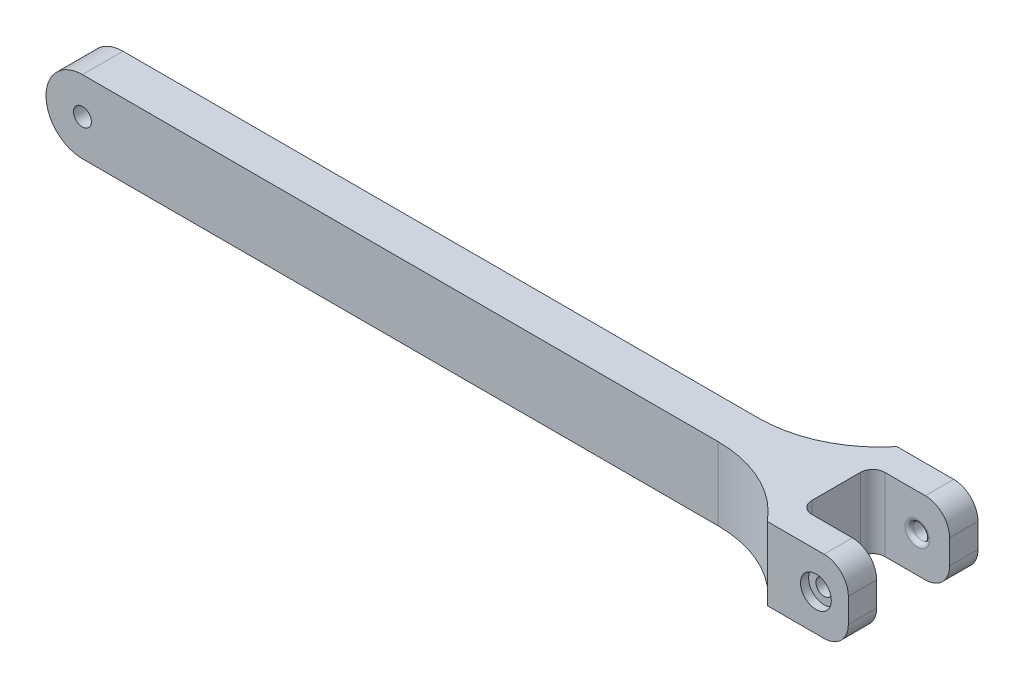
ISO-10303-21;
HEADER;
FILE_DESCRIPTION(('STEP AP214'),'2;1');
FILE_NAME('part.step','',(''),(''),'','','');
FILE_SCHEMA(('AUTOMOTIVE_DESIGN { 1 0 10303 214 1 1 1 1 }'));
ENDSEC;
DATA;
#1=APPLICATION_CONTEXT('core data for automotive mechanical design processes');
#2=APPLICATION_PROTOCOL_DEFINITION('international standard','automotive_design',2000,#1);
#3=PRODUCT_CONTEXT('',#1,'mechanical');
#4=PRODUCT('Part','Part','',(#3));
#5=PRODUCT_RELATED_PRODUCT_CATEGORY('part','',(#4));
#6=PRODUCT_DEFINITION_FORMATION('','',#4);
#7=PRODUCT_DEFINITION_CONTEXT('part definition',#1,'design');
#8=PRODUCT_DEFINITION('design','',#6,#7);
#9=PRODUCT_DEFINITION_SHAPE('','',#8);
#10=(LENGTH_UNIT() NAMED_UNIT(*) SI_UNIT(.MILLI.,.METRE.));
#11=(NAMED_UNIT(*) PLANE_ANGLE_UNIT() SI_UNIT($,.RADIAN.));
#12=(NAMED_UNIT(*) SI_UNIT($,.STERADIAN.) SOLID_ANGLE_UNIT());
#13=UNCERTAINTY_MEASURE_WITH_UNIT(LENGTH_MEASURE(1.E-05),#10,'distance_accuracy_value','');
#14=(GEOMETRIC_REPRESENTATION_CONTEXT(3) GLOBAL_UNCERTAINTY_ASSIGNED_CONTEXT((#13)) GLOBAL_UNIT_ASSIGNED_CONTEXT((#10,
#11,#12)) REPRESENTATION_CONTEXT('',''));
#15=CARTESIAN_POINT('',(0.,0.,0.));
#16=DIRECTION('',(0.,0.,1.));
#17=DIRECTION('',(1.,0.,0.));
#18=AXIS2_PLACEMENT_3D('',#15,#16,#17);
#19=CARTESIAN_POINT('',(96.,0.,-5.5));
#20=DIRECTION('',(0.,0.,1.));
#21=DIRECTION('',(1.,0.,0.));
#22=AXIS2_PLACEMENT_3D('',#19,#20,#21);
#23=CYLINDRICAL_SURFACE('',#22,0.999999999999998);
#24=CARTESIAN_POINT('',(96.,0.,7.));
#25=DIRECTION('',(0.,0.,1.));
#26=DIRECTION('',(1.,0.,0.));
#27=AXIS2_PLACEMENT_3D('',#24,#25,#26);
#28=CIRCLE('',#27,0.999999999999998);
#29=CARTESIAN_POINT('',(97.,0.,7.));
#30=VERTEX_POINT('',#29);
#31=EDGE_CURVE('E344',#30,#30,#28,.T.);
#32=ORIENTED_EDGE('',*,*,#31,.F.);
#33=EDGE_LOOP('',(#32));
#34=FACE_BOUND('',#33,.T.);
#35=CARTESIAN_POINT('',(96.,0.,9.5));
#36=DIRECTION('',(0.,0.,1.));
#37=DIRECTION('',(1.,0.,0.));
#38=AXIS2_PLACEMENT_3D('',#35,#36,#37);
#39=CIRCLE('',#38,0.999999999999998);
#40=CARTESIAN_POINT('',(97.,0.,9.5));
#41=VERTEX_POINT('',#40);
#42=EDGE_CURVE('E282',#41,#41,#39,.F.);
#43=ORIENTED_EDGE('',*,*,#42,.F.);
#44=EDGE_LOOP('',(#43));
#45=FACE_BOUND('',#44,.T.);
#46=ADVANCED_FACE('F36',(#34,#45),#23,.F.);
#47=CARTESIAN_POINT('',(0.,-4.5,5.));
#48=DIRECTION('',(0.,1.,0.));
#49=DIRECTION('',(0.,0.,1.));
#50=AXIS2_PLACEMENT_3D('',#47,#48,#49);
#51=PLANE('',#50);
#52=DIRECTION('',(0.,0.,1.));
#53=VECTOR('',#52,1.);
#54=CARTESIAN_POINT('',(90.5,-4.5,0.));
#55=LINE('',#54,#53);
#56=CARTESIAN_POINT('',(90.5,-4.5,-0.499999999999999));
#57=VERTEX_POINT('',#56);
#58=CARTESIAN_POINT('',(90.5,-4.5,5.5));
#59=VERTEX_POINT('',#58);
#60=EDGE_CURVE('E355',#57,#59,#55,.T.);
#61=ORIENTED_EDGE('',*,*,#60,.T.);
#62=CARTESIAN_POINT('',(92.,-4.5,5.5));
#63=DIRECTION('',(0.,1.,0.));
#64=DIRECTION('',(0.,0.,1.));
#65=AXIS2_PLACEMENT_3D('',#62,#63,#64);
#66=CIRCLE('',#65,1.5);
#67=CARTESIAN_POINT('',(92.,-4.5,7.));
#68=VERTEX_POINT('',#67);
#69=EDGE_CURVE('E51',#59,#68,#66,.T.);
#70=ORIENTED_EDGE('',*,*,#69,.T.);
#71=DIRECTION('',(1.,0.,0.));
#72=VECTOR('',#71,1.);
#73=CARTESIAN_POINT('',(0.,-4.5,7.));
#74=LINE('',#73,#72);
#75=CARTESIAN_POINT('',(97.,-4.5,7.));
#76=VERTEX_POINT('',#75);
#77=EDGE_CURVE('E353',#68,#76,#74,.T.);
#78=ORIENTED_EDGE('',*,*,#77,.T.);
#79=DIRECTION('',(0.,0.,1.));
#80=VECTOR('',#79,1.);
#81=CARTESIAN_POINT('',(97.,-4.5,5.));
#82=LINE('',#81,#80);
#83=CARTESIAN_POINT('',(97.,-4.5,10.5));
#84=VERTEX_POINT('',#83);
#85=EDGE_CURVE('E266',#76,#84,#82,.T.);
#86=ORIENTED_EDGE('',*,*,#85,.T.);
#87=DIRECTION('',(1.,0.,0.));
#88=VECTOR('',#87,1.);
#89=CARTESIAN_POINT('',(0.,-4.5,10.5));
#90=LINE('',#89,#88);
#91=CARTESIAN_POINT('',(90.,-4.5,10.5));
#92=VERTEX_POINT('',#91);
#93=EDGE_CURVE('E186',#92,#84,#90,.T.);
#94=ORIENTED_EDGE('',*,*,#93,.F.);
#95=CARTESIAN_POINT('',(78.3918132337561,-4.5,20.));
#96=DIRECTION('',(0.,1.,0.));
#97=DIRECTION('',(0.,0.,1.));
#98=AXIS2_PLACEMENT_3D('',#95,#96,#97);
#99=CIRCLE('',#98,15.);
#100=CARTESIAN_POINT('',(78.3918132337561,-4.5,5.));
#101=VERTEX_POINT('',#100);
#102=EDGE_CURVE('E241',#92,#101,#99,.T.);
#103=ORIENTED_EDGE('',*,*,#102,.T.);
#104=DIRECTION('',(1.,0.,0.));
#105=VECTOR('',#104,1.);
#106=CARTESIAN_POINT('',(0.,-4.5,5.));
#107=LINE('',#106,#105);
#108=CARTESIAN_POINT('',(0.,-4.5,5.));
#109=VERTEX_POINT('',#108);
#110=EDGE_CURVE('E217',#109,#101,#107,.T.);
#111=ORIENTED_EDGE('',*,*,#110,.F.);
#112=DIRECTION('',(0.,0.,-1.));
#113=VECTOR('',#112,1.);
#114=CARTESIAN_POINT('',(0.,-4.5,5.));
#115=LINE('',#114,#113);
#116=CARTESIAN_POINT('',(0.,-4.5,0.));
#117=VERTEX_POINT('',#116);
#118=EDGE_CURVE('E210',#109,#117,#115,.T.);
#119=ORIENTED_EDGE('',*,*,#118,.T.);
#120=DIRECTION('',(1.,0.,0.));
#121=VECTOR('',#120,1.);
#122=CARTESIAN_POINT('',(0.,-4.5,0.));
#123=LINE('',#122,#121);
#124=CARTESIAN_POINT('',(78.3918132337561,-4.5,0.));
#125=VERTEX_POINT('',#124);
#126=EDGE_CURVE('E170',#117,#125,#123,.T.);
#127=ORIENTED_EDGE('',*,*,#126,.T.);
#128=CARTESIAN_POINT('',(78.3918132337561,-4.5,-15.));
#129=DIRECTION('',(0.,1.,0.));
#130=DIRECTION('',(0.,0.,1.));
#131=AXIS2_PLACEMENT_3D('',#128,#129,#130);
#132=CIRCLE('',#131,15.);
#133=CARTESIAN_POINT('',(90.,-4.5,-5.5));
#134=VERTEX_POINT('',#133);
#135=EDGE_CURVE('E162',#125,#134,#132,.T.);
#136=ORIENTED_EDGE('',*,*,#135,.T.);
#137=DIRECTION('',(1.,0.,0.));
#138=VECTOR('',#137,1.);
#139=CARTESIAN_POINT('',(0.,-4.5,-5.5));
#140=LINE('',#139,#138);
#141=CARTESIAN_POINT('',(97.,-4.5,-5.5));
#142=VERTEX_POINT('',#141);
#143=EDGE_CURVE('E166',#134,#142,#140,.T.);
#144=ORIENTED_EDGE('',*,*,#143,.T.);
#145=DIRECTION('',(0.,0.,1.));
#146=VECTOR('',#145,1.);
#147=CARTESIAN_POINT('',(97.,-4.5,5.));
#148=LINE('',#147,#146);
#149=CARTESIAN_POINT('',(97.,-4.5,-2.));
#150=VERTEX_POINT('',#149);
#151=EDGE_CURVE('E264',#142,#150,#148,.T.);
#152=ORIENTED_EDGE('',*,*,#151,.T.);
#153=DIRECTION('',(-1.,0.,0.));
#154=VECTOR('',#153,1.);
#155=CARTESIAN_POINT('',(0.,-4.5,-1.99999999999999));
#156=LINE('',#155,#154);
#157=CARTESIAN_POINT('',(92.,-4.5,-2.));
#158=VERTEX_POINT('',#157);
#159=EDGE_CURVE('E187',#150,#158,#156,.T.);
#160=ORIENTED_EDGE('',*,*,#159,.T.);
#161=CARTESIAN_POINT('',(92.,-4.5,-0.499999999999999));
#162=DIRECTION('',(0.,1.,0.));
#163=DIRECTION('',(0.,0.,1.));
#164=AXIS2_PLACEMENT_3D('',#161,#162,#163);
#165=CIRCLE('',#164,1.5);
#166=EDGE_CURVE('E297',#158,#57,#165,.T.);
#167=ORIENTED_EDGE('',*,*,#166,.T.);
#168=EDGE_LOOP('',(#61,#70,#78,#86,#94,#103,#111,#119,#127,#136,#144,#152,#160,#167));
#169=FACE_BOUND('',#168,.T.);
#170=ADVANCED_FACE('F164',(#169),#51,.F.);
#171=CARTESIAN_POINT('',(0.,4.5,5.));
#172=DIRECTION('',(0.,1.,0.));
#173=DIRECTION('',(0.,0.,1.));
#174=AXIS2_PLACEMENT_3D('',#171,#172,#173);
#175=PLANE('',#174);
#176=DIRECTION('',(1.,0.,0.));
#177=VECTOR('',#176,1.);
#178=CARTESIAN_POINT('',(0.,4.5,10.5));
#179=LINE('',#178,#177);
#180=CARTESIAN_POINT('',(90.,4.5,10.5));
#181=VERTEX_POINT('',#180);
#182=CARTESIAN_POINT('',(97.,4.5,10.5));
#183=VERTEX_POINT('',#182);
#184=EDGE_CURVE('E356',#181,#183,#179,.T.);
#185=ORIENTED_EDGE('',*,*,#184,.T.);
#186=DIRECTION('',(0.,0.,1.));
#187=VECTOR('',#186,1.);
#188=CARTESIAN_POINT('',(97.,4.5,7.));
#189=LINE('',#188,#187);
#190=CARTESIAN_POINT('',(97.,4.5,7.));
#191=VERTEX_POINT('',#190);
#192=EDGE_CURVE('E256',#183,#191,#189,.F.);
#193=ORIENTED_EDGE('',*,*,#192,.T.);
#194=DIRECTION('',(1.,0.,0.));
#195=VECTOR('',#194,1.);
#196=CARTESIAN_POINT('',(0.,4.5,7.));
#197=LINE('',#196,#195);
#198=CARTESIAN_POINT('',(92.,4.5,7.));
#199=VERTEX_POINT('',#198);
#200=EDGE_CURVE('E347',#199,#191,#197,.T.);
#201=ORIENTED_EDGE('',*,*,#200,.F.);
#202=CARTESIAN_POINT('',(92.,4.5,5.5));
#203=DIRECTION('',(0.,1.,0.));
#204=DIRECTION('',(0.,0.,1.));
#205=AXIS2_PLACEMENT_3D('',#202,#203,#204);
#206=CIRCLE('',#205,1.5);
#207=CARTESIAN_POINT('',(90.5,4.5,5.5));
#208=VERTEX_POINT('',#207);
#209=EDGE_CURVE('E59',#199,#208,#206,.F.);
#210=ORIENTED_EDGE('',*,*,#209,.T.);
#211=DIRECTION('',(0.,0.,1.));
#212=VECTOR('',#211,1.);
#213=CARTESIAN_POINT('',(90.5,4.5,0.));
#214=LINE('',#213,#212);
#215=CARTESIAN_POINT('',(90.5,4.5,-0.499999999999999));
#216=VERTEX_POINT('',#215);
#217=EDGE_CURVE('E363',#216,#208,#214,.T.);
#218=ORIENTED_EDGE('',*,*,#217,.F.);
#219=CARTESIAN_POINT('',(92.,4.5,-0.499999999999999));
#220=DIRECTION('',(0.,1.,0.));
#221=DIRECTION('',(0.,0.,1.));
#222=AXIS2_PLACEMENT_3D('',#219,#220,#221);
#223=CIRCLE('',#222,1.5);
#224=CARTESIAN_POINT('',(92.,4.5,-2.));
#225=VERTEX_POINT('',#224);
#226=EDGE_CURVE('E295',#216,#225,#223,.F.);
#227=ORIENTED_EDGE('',*,*,#226,.T.);
#228=DIRECTION('',(-1.,0.,0.));
#229=VECTOR('',#228,1.);
#230=CARTESIAN_POINT('',(0.,4.5,-1.99999999999999));
#231=LINE('',#230,#229);
#232=CARTESIAN_POINT('',(97.,4.5,-2.));
#233=VERTEX_POINT('',#232);
#234=EDGE_CURVE('E366',#233,#225,#231,.T.);
#235=ORIENTED_EDGE('',*,*,#234,.F.);
#236=DIRECTION('',(0.,0.,1.));
#237=VECTOR('',#236,1.);
#238=CARTESIAN_POINT('',(97.,4.5,-5.5));
#239=LINE('',#238,#237);
#240=CARTESIAN_POINT('',(97.,4.5,-5.5));
#241=VERTEX_POINT('',#240);
#242=EDGE_CURVE('E254',#233,#241,#239,.F.);
#243=ORIENTED_EDGE('',*,*,#242,.T.);
#244=DIRECTION('',(1.,0.,0.));
#245=VECTOR('',#244,1.);
#246=CARTESIAN_POINT('',(0.,4.5,-5.5));
#247=LINE('',#246,#245);
#248=CARTESIAN_POINT('',(90.,4.5,-5.5));
#249=VERTEX_POINT('',#248);
#250=EDGE_CURVE('E369',#249,#241,#247,.T.);
#251=ORIENTED_EDGE('',*,*,#250,.F.);
#252=CARTESIAN_POINT('',(78.3918132337561,4.5,-15.));
#253=DIRECTION('',(0.,1.,0.));
#254=DIRECTION('',(0.,0.,1.));
#255=AXIS2_PLACEMENT_3D('',#252,#253,#254);
#256=CIRCLE('',#255,15.);
#257=CARTESIAN_POINT('',(78.3918132337561,4.5,0.));
#258=VERTEX_POINT('',#257);
#259=EDGE_CURVE('E175',#249,#258,#256,.F.);
#260=ORIENTED_EDGE('',*,*,#259,.T.);
#261=DIRECTION('',(1.,0.,0.));
#262=VECTOR('',#261,1.);
#263=CARTESIAN_POINT('',(0.,4.5,0.));
#264=LINE('',#263,#262);
#265=CARTESIAN_POINT('',(0.,4.5,0.));
#266=VERTEX_POINT('',#265);
#267=EDGE_CURVE('E214',#266,#258,#264,.T.);
#268=ORIENTED_EDGE('',*,*,#267,.F.);
#269=DIRECTION('',(0.,0.,-1.));
#270=VECTOR('',#269,1.);
#271=CARTESIAN_POINT('',(0.,4.5,5.));
#272=LINE('',#271,#270);
#273=CARTESIAN_POINT('',(0.,4.5,5.));
#274=VERTEX_POINT('',#273);
#275=EDGE_CURVE('E219',#274,#266,#272,.T.);
#276=ORIENTED_EDGE('',*,*,#275,.F.);
#277=DIRECTION('',(1.,0.,0.));
#278=VECTOR('',#277,1.);
#279=CARTESIAN_POINT('',(0.,4.5,5.));
#280=LINE('',#279,#278);
#281=CARTESIAN_POINT('',(78.3918132337561,4.5,5.));
#282=VERTEX_POINT('',#281);
#283=EDGE_CURVE('E207',#274,#282,#280,.T.);
#284=ORIENTED_EDGE('',*,*,#283,.T.);
#285=CARTESIAN_POINT('',(78.3918132337561,4.5,20.));
#286=DIRECTION('',(0.,1.,0.));
#287=DIRECTION('',(0.,0.,1.));
#288=AXIS2_PLACEMENT_3D('',#285,#286,#287);
#289=CIRCLE('',#288,15.);
#290=EDGE_CURVE('E243',#282,#181,#289,.F.);
#291=ORIENTED_EDGE('',*,*,#290,.T.);
#292=EDGE_LOOP('',(#185,#193,#201,#210,#218,#227,#235,#243,#251,#260,#268,#276,#284,#291));
#293=FACE_BOUND('',#292,.T.);
#294=ADVANCED_FACE('F321',(#293),#175,.T.);
#295=CARTESIAN_POINT('',(0.,0.,5.));
#296=DIRECTION('',(0.,0.,-1.));
#297=DIRECTION('',(-1.,0.,0.));
#298=AXIS2_PLACEMENT_3D('',#295,#296,#297);
#299=CYLINDRICAL_SURFACE('',#298,4.5);
#300=CARTESIAN_POINT('',(0.,0.,0.));
#301=DIRECTION('',(0.,0.,1.));
#302=DIRECTION('',(1.,0.,0.));
#303=AXIS2_PLACEMENT_3D('',#300,#301,#302);
#304=CIRCLE('',#303,4.5);
#305=EDGE_CURVE('E211',#266,#117,#304,.T.);
#306=ORIENTED_EDGE('',*,*,#305,.T.);
#307=ORIENTED_EDGE('',*,*,#118,.F.);
#308=CARTESIAN_POINT('',(0.,0.,5.));
#309=DIRECTION('',(0.,0.,1.));
#310=DIRECTION('',(1.,0.,0.));
#311=AXIS2_PLACEMENT_3D('',#308,#309,#310);
#312=CIRCLE('',#311,4.5);
#313=EDGE_CURVE('E204',#274,#109,#312,.T.);
#314=ORIENTED_EDGE('',*,*,#313,.F.);
#315=ORIENTED_EDGE('',*,*,#275,.T.);
#316=EDGE_LOOP('',(#306,#307,#314,#315));
#317=FACE_BOUND('',#316,.T.);
#318=ADVANCED_FACE('F405',(#317),#299,.T.);
#319=CARTESIAN_POINT('',(0.,0.,5.));
#320=DIRECTION('',(0.,0.,-1.));
#321=DIRECTION('',(-1.,0.,0.));
#322=AXIS2_PLACEMENT_3D('',#319,#320,#321);
#323=CYLINDRICAL_SURFACE('',#322,1.1);
#324=CARTESIAN_POINT('',(0.,0.,5.));
#325=DIRECTION('',(0.,0.,1.));
#326=DIRECTION('',(1.,0.,0.));
#327=AXIS2_PLACEMENT_3D('',#324,#325,#326);
#328=CIRCLE('',#327,1.1);
#329=CARTESIAN_POINT('',(1.1,0.,5.));
#330=VERTEX_POINT('',#329);
#331=EDGE_CURVE('E206',#330,#330,#328,.T.);
#332=ORIENTED_EDGE('',*,*,#331,.T.);
#333=EDGE_LOOP('',(#332));
#334=FACE_BOUND('',#333,.T.);
#335=CARTESIAN_POINT('',(0.,0.,0.));
#336=DIRECTION('',(0.,0.,1.));
#337=DIRECTION('',(1.,0.,0.));
#338=AXIS2_PLACEMENT_3D('',#335,#336,#337);
#339=CIRCLE('',#338,1.1);
#340=CARTESIAN_POINT('',(1.1,0.,0.));
#341=VERTEX_POINT('',#340);
#342=EDGE_CURVE('E213',#341,#341,#339,.T.);
#343=ORIENTED_EDGE('',*,*,#342,.F.);
#344=EDGE_LOOP('',(#343));
#345=FACE_BOUND('',#344,.T.);
#346=ADVANCED_FACE('F447',(#334,#345),#323,.F.);
#347=CARTESIAN_POINT('',(0.,0.,5.));
#348=DIRECTION('',(0.,0.,1.));
#349=DIRECTION('',(1.,0.,0.));
#350=AXIS2_PLACEMENT_3D('',#347,#348,#349);
#351=PLANE('',#350);
#352=ORIENTED_EDGE('',*,*,#110,.T.);
#353=DIRECTION('',(0.,-1.,0.));
#354=VECTOR('',#353,1.);
#355=CARTESIAN_POINT('',(78.3918132337561,4.5,5.));
#356=LINE('',#355,#354);
#357=EDGE_CURVE('E176',#101,#282,#356,.F.);
#358=ORIENTED_EDGE('',*,*,#357,.T.);
#359=ORIENTED_EDGE('',*,*,#283,.F.);
#360=ORIENTED_EDGE('',*,*,#313,.T.);
#361=EDGE_LOOP('',(#352,#358,#359,#360));
#362=FACE_BOUND('',#361,.T.);
#363=ORIENTED_EDGE('',*,*,#331,.F.);
#364=EDGE_LOOP('',(#363));
#365=FACE_BOUND('',#364,.T.);
#366=ADVANCED_FACE('F399',(#362,#365),#351,.T.);
#367=CARTESIAN_POINT('',(0.,0.,0.));
#368=DIRECTION('',(0.,0.,1.));
#369=DIRECTION('',(1.,0.,0.));
#370=AXIS2_PLACEMENT_3D('',#367,#368,#369);
#371=PLANE('',#370);
#372=ORIENTED_EDGE('',*,*,#267,.T.);
#373=DIRECTION('',(0.,1.,0.));
#374=VECTOR('',#373,1.);
#375=CARTESIAN_POINT('',(78.3918132337561,0.,0.));
#376=LINE('',#375,#374);
#377=EDGE_CURVE('E221',#258,#125,#376,.F.);
#378=ORIENTED_EDGE('',*,*,#377,.T.);
#379=ORIENTED_EDGE('',*,*,#126,.F.);
#380=ORIENTED_EDGE('',*,*,#305,.F.);
#381=EDGE_LOOP('',(#372,#378,#379,#380));
#382=FACE_BOUND('',#381,.T.);
#383=ORIENTED_EDGE('',*,*,#342,.T.);
#384=EDGE_LOOP('',(#383));
#385=FACE_BOUND('',#384,.T.);
#386=ADVANCED_FACE('F408',(#382,#385),#371,.F.);
#387=CARTESIAN_POINT('',(0.,-4.5,7.));
#388=DIRECTION('',(0.,0.,1.));
#389=DIRECTION('',(1.,0.,0.));
#390=AXIS2_PLACEMENT_3D('',#387,#388,#389);
#391=PLANE('',#390);
#392=ORIENTED_EDGE('',*,*,#31,.T.);
#393=EDGE_LOOP('',(#392));
#394=FACE_BOUND('',#393,.T.);
#395=ORIENTED_EDGE('',*,*,#77,.F.);
#396=DIRECTION('',(0.,1.,0.));
#397=VECTOR('',#396,1.);
#398=CARTESIAN_POINT('',(92.,4.5,7.));
#399=LINE('',#398,#397);
#400=EDGE_CURVE('E293',#68,#199,#399,.T.);
#401=ORIENTED_EDGE('',*,*,#400,.T.);
#402=ORIENTED_EDGE('',*,*,#200,.T.);
#403=CARTESIAN_POINT('',(97.,1.5,7.));
#404=DIRECTION('',(0.,0.,1.));
#405=DIRECTION('',(1.,0.,0.));
#406=AXIS2_PLACEMENT_3D('',#403,#404,#405);
#407=CIRCLE('',#406,3.);
#408=CARTESIAN_POINT('',(100.,1.5,7.));
#409=VERTEX_POINT('',#408);
#410=EDGE_CURVE('E262',#191,#409,#407,.F.);
#411=ORIENTED_EDGE('',*,*,#410,.T.);
#412=DIRECTION('',(0.,1.,0.));
#413=VECTOR('',#412,1.);
#414=CARTESIAN_POINT('',(100.,-4.5,7.));
#415=LINE('',#414,#413);
#416=CARTESIAN_POINT('',(100.,-1.5,7.));
#417=VERTEX_POINT('',#416);
#418=EDGE_CURVE('E235',#417,#409,#415,.T.);
#419=ORIENTED_EDGE('',*,*,#418,.F.);
#420=CARTESIAN_POINT('',(97.,-1.5,7.));
#421=DIRECTION('',(0.,0.,1.));
#422=DIRECTION('',(1.,0.,0.));
#423=AXIS2_PLACEMENT_3D('',#420,#421,#422);
#424=CIRCLE('',#423,3.);
#425=EDGE_CURVE('E259',#417,#76,#424,.F.);
#426=ORIENTED_EDGE('',*,*,#425,.T.);
#427=EDGE_LOOP('',(#395,#401,#402,#411,#419,#426));
#428=FACE_BOUND('',#427,.T.);
#429=ADVANCED_FACE('F388',(#394,#428),#391,.F.);
#430=CARTESIAN_POINT('',(100.,-4.5,0.));
#431=DIRECTION('',(-1.,0.,0.));
#432=DIRECTION('',(0.,0.,1.));
#433=AXIS2_PLACEMENT_3D('',#430,#431,#432);
#434=PLANE('',#433);
#435=ORIENTED_EDGE('',*,*,#418,.T.);
#436=DIRECTION('',(0.,0.,1.));
#437=VECTOR('',#436,1.);
#438=CARTESIAN_POINT('',(100.,1.5,10.5));
#439=LINE('',#438,#437);
#440=CARTESIAN_POINT('',(100.,1.5,10.5));
#441=VERTEX_POINT('',#440);
#442=EDGE_CURVE('E247',#409,#441,#439,.T.);
#443=ORIENTED_EDGE('',*,*,#442,.T.);
#444=DIRECTION('',(0.,1.,0.));
#445=VECTOR('',#444,1.);
#446=CARTESIAN_POINT('',(100.,-4.5,10.5));
#447=LINE('',#446,#445);
#448=CARTESIAN_POINT('',(100.,-1.5,10.5));
#449=VERTEX_POINT('',#448);
#450=EDGE_CURVE('E195',#449,#441,#447,.T.);
#451=ORIENTED_EDGE('',*,*,#450,.F.);
#452=DIRECTION('',(0.,0.,1.));
#453=VECTOR('',#452,1.);
#454=CARTESIAN_POINT('',(100.,-1.5,0.));
#455=LINE('',#454,#453);
#456=EDGE_CURVE('E245',#449,#417,#455,.F.);
#457=ORIENTED_EDGE('',*,*,#456,.T.);
#458=EDGE_LOOP('',(#435,#443,#451,#457));
#459=FACE_BOUND('',#458,.T.);
#460=ADVANCED_FACE('F381',(#459),#434,.F.);
#461=CARTESIAN_POINT('',(0.,-4.5,10.5));
#462=DIRECTION('',(0.,0.,1.));
#463=DIRECTION('',(1.,0.,0.));
#464=AXIS2_PLACEMENT_3D('',#461,#462,#463);
#465=PLANE('',#464);
#466=CARTESIAN_POINT('',(96.,0.,10.5));
#467=DIRECTION('',(0.,0.,1.));
#468=DIRECTION('',(1.,0.,0.));
#469=AXIS2_PLACEMENT_3D('',#466,#467,#468);
#470=CIRCLE('',#469,1.9);
#471=CARTESIAN_POINT('',(97.9,0.,10.5));
#472=VERTEX_POINT('',#471);
#473=EDGE_CURVE('E350',#472,#472,#470,.T.);
#474=ORIENTED_EDGE('',*,*,#473,.F.);
#475=EDGE_LOOP('',(#474));
#476=FACE_BOUND('',#475,.T.);
#477=ORIENTED_EDGE('',*,*,#450,.T.);
#478=CARTESIAN_POINT('',(97.,1.5,10.5));
#479=DIRECTION('',(0.,0.,1.));
#480=DIRECTION('',(1.,0.,0.));
#481=AXIS2_PLACEMENT_3D('',#478,#479,#480);
#482=CIRCLE('',#481,3.);
#483=EDGE_CURVE('E252',#441,#183,#482,.T.);
#484=ORIENTED_EDGE('',*,*,#483,.T.);
#485=ORIENTED_EDGE('',*,*,#184,.F.);
#486=DIRECTION('',(0.,1.,0.));
#487=VECTOR('',#486,1.);
#488=CARTESIAN_POINT('',(90.,-4.5,10.5));
#489=LINE('',#488,#487);
#490=EDGE_CURVE('E191',#92,#181,#489,.T.);
#491=ORIENTED_EDGE('',*,*,#490,.F.);
#492=ORIENTED_EDGE('',*,*,#93,.T.);
#493=CARTESIAN_POINT('',(97.,-1.5,10.5));
#494=DIRECTION('',(0.,0.,1.));
#495=DIRECTION('',(1.,0.,0.));
#496=AXIS2_PLACEMENT_3D('',#493,#494,#495);
#497=CIRCLE('',#496,3.);
#498=EDGE_CURVE('E250',#84,#449,#497,.T.);
#499=ORIENTED_EDGE('',*,*,#498,.T.);
#500=EDGE_LOOP('',(#477,#484,#485,#491,#492,#499));
#501=FACE_BOUND('',#500,.T.);
#502=ADVANCED_FACE('F377',(#476,#501),#465,.T.);
#503=CARTESIAN_POINT('',(0.,-4.5,-5.5));
#504=DIRECTION('',(0.,0.,1.));
#505=DIRECTION('',(1.,0.,0.));
#506=AXIS2_PLACEMENT_3D('',#503,#504,#505);
#507=PLANE('',#506);
#508=CARTESIAN_POINT('',(96.,0.,-5.5));
#509=DIRECTION('',(0.,0.,1.));
#510=DIRECTION('',(1.,0.,0.));
#511=AXIS2_PLACEMENT_3D('',#508,#509,#510);
#512=CIRCLE('',#511,0.999999999999998);
#513=CARTESIAN_POINT('',(97.,0.,-5.5));
#514=VERTEX_POINT('',#513);
#515=EDGE_CURVE('E285',#514,#514,#512,.T.);
#516=ORIENTED_EDGE('',*,*,#515,.T.);
#517=EDGE_LOOP('',(#516));
#518=FACE_BOUND('',#517,.T.);
#519=DIRECTION('',(0.,1.,0.));
#520=VECTOR('',#519,1.);
#521=CARTESIAN_POINT('',(100.,-4.5,-5.5));
#522=LINE('',#521,#520);
#523=CARTESIAN_POINT('',(100.,-1.5,-5.5));
#524=VERTEX_POINT('',#523);
#525=CARTESIAN_POINT('',(100.,1.5,-5.5));
#526=VERTEX_POINT('',#525);
#527=EDGE_CURVE('E192',#524,#526,#522,.T.);
#528=ORIENTED_EDGE('',*,*,#527,.F.);
#529=CARTESIAN_POINT('',(97.,-1.5,-5.5));
#530=DIRECTION('',(0.,0.,1.));
#531=DIRECTION('',(1.,0.,0.));
#532=AXIS2_PLACEMENT_3D('',#529,#530,#531);
#533=CIRCLE('',#532,3.);
#534=EDGE_CURVE('E185',#524,#142,#533,.F.);
#535=ORIENTED_EDGE('',*,*,#534,.T.);
#536=ORIENTED_EDGE('',*,*,#143,.F.);
#537=DIRECTION('',(0.,1.,0.));
#538=VECTOR('',#537,1.);
#539=CARTESIAN_POINT('',(90.,-4.5,-5.5));
#540=LINE('',#539,#538);
#541=EDGE_CURVE('E182',#134,#249,#540,.T.);
#542=ORIENTED_EDGE('',*,*,#541,.T.);
#543=ORIENTED_EDGE('',*,*,#250,.T.);
#544=CARTESIAN_POINT('',(97.,1.5,-5.5));
#545=DIRECTION('',(0.,0.,1.));
#546=DIRECTION('',(1.,0.,0.));
#547=AXIS2_PLACEMENT_3D('',#544,#545,#546);
#548=CIRCLE('',#547,3.);
#549=EDGE_CURVE('E278',#241,#526,#548,.F.);
#550=ORIENTED_EDGE('',*,*,#549,.T.);
#551=EDGE_LOOP('',(#528,#535,#536,#542,#543,#550));
#552=FACE_BOUND('',#551,.T.);
#553=ADVANCED_FACE('F180',(#518,#552),#507,.F.);
#554=DIRECTION('',(0.,1.,0.));
#555=VECTOR('',#554,1.);
#556=CARTESIAN_POINT('',(100.,-4.5,-2.));
#557=LINE('',#556,#555);
#558=CARTESIAN_POINT('',(100.,-1.5,-2.));
#559=VERTEX_POINT('',#558);
#560=CARTESIAN_POINT('',(100.,1.5,-2.));
#561=VERTEX_POINT('',#560);
#562=EDGE_CURVE('E198',#559,#561,#557,.T.);
#563=ORIENTED_EDGE('',*,*,#562,.F.);
#564=DIRECTION('',(0.,0.,1.));
#565=VECTOR('',#564,1.);
#566=CARTESIAN_POINT('',(100.,-1.5,0.));
#567=LINE('',#566,#565);
#568=EDGE_CURVE('E276',#559,#524,#567,.F.);
#569=ORIENTED_EDGE('',*,*,#568,.T.);
#570=ORIENTED_EDGE('',*,*,#527,.T.);
#571=DIRECTION('',(0.,0.,1.));
#572=VECTOR('',#571,1.);
#573=CARTESIAN_POINT('',(100.,1.5,-2.));
#574=LINE('',#573,#572);
#575=EDGE_CURVE('E273',#526,#561,#574,.T.);
#576=ORIENTED_EDGE('',*,*,#575,.T.);
#577=EDGE_LOOP('',(#563,#569,#570,#576));
#578=FACE_BOUND('',#577,.T.);
#579=ADVANCED_FACE('F419',(#578),#434,.F.);
#580=CARTESIAN_POINT('',(0.,-4.5,-1.99999999999999));
#581=DIRECTION('',(0.,0.,-1.));
#582=DIRECTION('',(-1.,0.,0.));
#583=AXIS2_PLACEMENT_3D('',#580,#581,#582);
#584=PLANE('',#583);
#585=CARTESIAN_POINT('',(96.,0.,-2.));
#586=DIRECTION('',(0.,0.,-1.));
#587=DIRECTION('',(-1.,0.,0.));
#588=AXIS2_PLACEMENT_3D('',#585,#586,#587);
#589=CIRCLE('',#588,1.5);
#590=CARTESIAN_POINT('',(94.5,0.,-2.));
#591=VERTEX_POINT('',#590);
#592=EDGE_CURVE('E44',#591,#591,#589,.T.);
#593=ORIENTED_EDGE('',*,*,#592,.T.);
#594=EDGE_LOOP('',(#593));
#595=FACE_BOUND('',#594,.T.);
#596=ORIENTED_EDGE('',*,*,#234,.T.);
#597=DIRECTION('',(0.,1.,0.));
#598=VECTOR('',#597,1.);
#599=CARTESIAN_POINT('',(92.,-4.5,-2.));
#600=LINE('',#599,#598);
#601=EDGE_CURVE('E291',#225,#158,#600,.F.);
#602=ORIENTED_EDGE('',*,*,#601,.T.);
#603=ORIENTED_EDGE('',*,*,#159,.F.);
#604=CARTESIAN_POINT('',(97.,-1.5,-2.));
#605=DIRECTION('',(0.,0.,-1.));
#606=DIRECTION('',(-1.,0.,0.));
#607=AXIS2_PLACEMENT_3D('',#604,#605,#606);
#608=CIRCLE('',#607,3.);
#609=EDGE_CURVE('E271',#150,#559,#608,.F.);
#610=ORIENTED_EDGE('',*,*,#609,.T.);
#611=ORIENTED_EDGE('',*,*,#562,.T.);
#612=CARTESIAN_POINT('',(97.,1.5,-2.));
#613=DIRECTION('',(0.,0.,-1.));
#614=DIRECTION('',(-1.,0.,0.));
#615=AXIS2_PLACEMENT_3D('',#612,#613,#614);
#616=CIRCLE('',#615,3.);
#617=EDGE_CURVE('E269',#561,#233,#616,.F.);
#618=ORIENTED_EDGE('',*,*,#617,.T.);
#619=EDGE_LOOP('',(#596,#602,#603,#610,#611,#618));
#620=FACE_BOUND('',#619,.T.);
#621=ADVANCED_FACE('F303',(#595,#620),#584,.F.);
#622=CARTESIAN_POINT('',(90.5,-4.5,0.));
#623=DIRECTION('',(-1.,0.,0.));
#624=DIRECTION('',(0.,0.,1.));
#625=AXIS2_PLACEMENT_3D('',#622,#623,#624);
#626=PLANE('',#625);
#627=ORIENTED_EDGE('',*,*,#60,.F.);
#628=DIRECTION('',(0.,1.,0.));
#629=VECTOR('',#628,1.);
#630=CARTESIAN_POINT('',(90.5,4.5,-0.499999999999999));
#631=LINE('',#630,#629);
#632=EDGE_CURVE('E288',#57,#216,#631,.T.);
#633=ORIENTED_EDGE('',*,*,#632,.T.);
#634=ORIENTED_EDGE('',*,*,#217,.T.);
#635=DIRECTION('',(0.,1.,0.));
#636=VECTOR('',#635,1.);
#637=CARTESIAN_POINT('',(90.5,-4.5,5.5));
#638=LINE('',#637,#636);
#639=EDGE_CURVE('E281',#208,#59,#638,.F.);
#640=ORIENTED_EDGE('',*,*,#639,.T.);
#641=EDGE_LOOP('',(#627,#633,#634,#640));
#642=FACE_BOUND('',#641,.T.);
#643=ADVANCED_FACE('F431',(#642),#626,.F.);
#644=CARTESIAN_POINT('',(78.3918132337561,-4.5,-15.));
#645=DIRECTION('',(0.,1.,0.));
#646=DIRECTION('',(0.,0.,1.));
#647=AXIS2_PLACEMENT_3D('',#644,#645,#646);
#648=CYLINDRICAL_SURFACE('',#647,15.);
#649=ORIENTED_EDGE('',*,*,#259,.F.);
#650=ORIENTED_EDGE('',*,*,#541,.F.);
#651=ORIENTED_EDGE('',*,*,#135,.F.);
#652=ORIENTED_EDGE('',*,*,#377,.F.);
#653=EDGE_LOOP('',(#649,#650,#651,#652));
#654=FACE_BOUND('',#653,.T.);
#655=ADVANCED_FACE('F190',(#654),#648,.F.);
#656=CARTESIAN_POINT('',(78.3918132337561,-4.5,20.));
#657=DIRECTION('',(0.,1.,0.));
#658=DIRECTION('',(0.,0.,1.));
#659=AXIS2_PLACEMENT_3D('',#656,#657,#658);
#660=CYLINDRICAL_SURFACE('',#659,15.);
#661=ORIENTED_EDGE('',*,*,#290,.F.);
#662=ORIENTED_EDGE('',*,*,#357,.F.);
#663=ORIENTED_EDGE('',*,*,#102,.F.);
#664=ORIENTED_EDGE('',*,*,#490,.T.);
#665=EDGE_LOOP('',(#661,#662,#663,#664));
#666=FACE_BOUND('',#665,.T.);
#667=ADVANCED_FACE('F329',(#666),#660,.F.);
#668=CARTESIAN_POINT('',(96.,0.,-2.5));
#669=DIRECTION('',(0.,0.,-1.));
#670=DIRECTION('',(-1.,0.,0.));
#671=AXIS2_PLACEMENT_3D('',#668,#669,#670);
#672=CIRCLE('',#671,0.999999999999998);
#673=CARTESIAN_POINT('',(95.,0.,-2.5));
#674=VERTEX_POINT('',#673);
#675=EDGE_CURVE('E11',#674,#674,#672,.F.);
#676=ORIENTED_EDGE('',*,*,#675,.T.);
#677=EDGE_LOOP('',(#676));
#678=FACE_BOUND('',#677,.T.);
#679=ORIENTED_EDGE('',*,*,#515,.F.);
#680=EDGE_LOOP('',(#679));
#681=FACE_BOUND('',#680,.T.);
#682=ADVANCED_FACE('F317',(#678,#681),#23,.F.);
#683=CARTESIAN_POINT('',(97.,1.5,0.));
#684=DIRECTION('',(0.,0.,-1.));
#685=DIRECTION('',(-1.,0.,0.));
#686=AXIS2_PLACEMENT_3D('',#683,#684,#685);
#687=CYLINDRICAL_SURFACE('',#686,3.);
#688=ORIENTED_EDGE('',*,*,#410,.F.);
#689=ORIENTED_EDGE('',*,*,#192,.F.);
#690=ORIENTED_EDGE('',*,*,#483,.F.);
#691=ORIENTED_EDGE('',*,*,#442,.F.);
#692=EDGE_LOOP('',(#688,#689,#690,#691));
#693=FACE_BOUND('',#692,.T.);
#694=ADVANCED_FACE('F328',(#693),#687,.T.);
#695=CARTESIAN_POINT('',(97.,-1.5,5.));
#696=DIRECTION('',(0.,0.,1.));
#697=DIRECTION('',(1.,0.,0.));
#698=AXIS2_PLACEMENT_3D('',#695,#696,#697);
#699=CYLINDRICAL_SURFACE('',#698,3.);
#700=ORIENTED_EDGE('',*,*,#425,.F.);
#701=ORIENTED_EDGE('',*,*,#456,.F.);
#702=ORIENTED_EDGE('',*,*,#498,.F.);
#703=ORIENTED_EDGE('',*,*,#85,.F.);
#704=EDGE_LOOP('',(#700,#701,#702,#703));
#705=FACE_BOUND('',#704,.T.);
#706=ADVANCED_FACE('F335',(#705),#699,.T.);
#707=CARTESIAN_POINT('',(97.,-1.5,5.));
#708=DIRECTION('',(0.,0.,1.));
#709=DIRECTION('',(1.,0.,0.));
#710=AXIS2_PLACEMENT_3D('',#707,#708,#709);
#711=CYLINDRICAL_SURFACE('',#710,3.);
#712=ORIENTED_EDGE('',*,*,#534,.F.);
#713=ORIENTED_EDGE('',*,*,#568,.F.);
#714=ORIENTED_EDGE('',*,*,#609,.F.);
#715=ORIENTED_EDGE('',*,*,#151,.F.);
#716=EDGE_LOOP('',(#712,#713,#714,#715));
#717=FACE_BOUND('',#716,.T.);
#718=ADVANCED_FACE('F423',(#717),#711,.T.);
#719=CARTESIAN_POINT('',(97.,1.5,0.));
#720=DIRECTION('',(0.,0.,-1.));
#721=DIRECTION('',(-1.,0.,0.));
#722=AXIS2_PLACEMENT_3D('',#719,#720,#721);
#723=CYLINDRICAL_SURFACE('',#722,3.);
#724=ORIENTED_EDGE('',*,*,#549,.F.);
#725=ORIENTED_EDGE('',*,*,#242,.F.);
#726=ORIENTED_EDGE('',*,*,#617,.F.);
#727=ORIENTED_EDGE('',*,*,#575,.F.);
#728=EDGE_LOOP('',(#724,#725,#726,#727));
#729=FACE_BOUND('',#728,.T.);
#730=ADVANCED_FACE('F416',(#729),#723,.T.);
#731=CARTESIAN_POINT('',(96.,0.,9.5));
#732=DIRECTION('',(0.,0.,1.));
#733=DIRECTION('',(1.,0.,0.));
#734=AXIS2_PLACEMENT_3D('',#731,#732,#733);
#735=PLANE('',#734);
#736=CARTESIAN_POINT('',(96.,0.,9.5));
#737=DIRECTION('',(0.,0.,1.));
#738=DIRECTION('',(1.,0.,0.));
#739=AXIS2_PLACEMENT_3D('',#736,#737,#738);
#740=CIRCLE('',#739,1.9);
#741=CARTESIAN_POINT('',(97.9,0.,9.5));
#742=VERTEX_POINT('',#741);
#743=EDGE_CURVE('E286',#742,#742,#740,.T.);
#744=ORIENTED_EDGE('',*,*,#743,.T.);
#745=EDGE_LOOP('',(#744));
#746=FACE_BOUND('',#745,.T.);
#747=ORIENTED_EDGE('',*,*,#42,.T.);
#748=EDGE_LOOP('',(#747));
#749=FACE_BOUND('',#748,.T.);
#750=ADVANCED_FACE('F463',(#746,#749),#735,.T.);
#751=CARTESIAN_POINT('',(96.,0.,9.5));
#752=DIRECTION('',(0.,0.,1.));
#753=DIRECTION('',(1.,0.,0.));
#754=AXIS2_PLACEMENT_3D('',#751,#752,#753);
#755=CYLINDRICAL_SURFACE('',#754,1.9);
#756=ORIENTED_EDGE('',*,*,#743,.F.);
#757=EDGE_LOOP('',(#756));
#758=FACE_BOUND('',#757,.T.);
#759=ORIENTED_EDGE('',*,*,#473,.T.);
#760=EDGE_LOOP('',(#759));
#761=FACE_BOUND('',#760,.T.);
#762=ADVANCED_FACE('F465',(#758,#761),#755,.F.);
#763=CARTESIAN_POINT('',(92.,-4.5,-0.499999999999999));
#764=DIRECTION('',(0.,-1.,0.));
#765=DIRECTION('',(0.,0.,-1.));
#766=AXIS2_PLACEMENT_3D('',#763,#764,#765);
#767=CYLINDRICAL_SURFACE('',#766,1.5);
#768=ORIENTED_EDGE('',*,*,#166,.F.);
#769=ORIENTED_EDGE('',*,*,#601,.F.);
#770=ORIENTED_EDGE('',*,*,#226,.F.);
#771=ORIENTED_EDGE('',*,*,#632,.F.);
#772=EDGE_LOOP('',(#768,#769,#770,#771));
#773=FACE_BOUND('',#772,.T.);
#774=ADVANCED_FACE('F312',(#773),#767,.F.);
#775=CARTESIAN_POINT('',(92.,-4.5,5.5));
#776=DIRECTION('',(0.,-1.,0.));
#777=DIRECTION('',(0.,0.,-1.));
#778=AXIS2_PLACEMENT_3D('',#775,#776,#777);
#779=CYLINDRICAL_SURFACE('',#778,1.5);
#780=ORIENTED_EDGE('',*,*,#69,.F.);
#781=ORIENTED_EDGE('',*,*,#639,.F.);
#782=ORIENTED_EDGE('',*,*,#209,.F.);
#783=ORIENTED_EDGE('',*,*,#400,.F.);
#784=EDGE_LOOP('',(#780,#781,#782,#783));
#785=FACE_BOUND('',#784,.T.);
#786=ADVANCED_FACE('F307',(#785),#779,.F.);
#787=CARTESIAN_POINT('',(96.,0.,-2.5));
#788=DIRECTION('',(0.,0.,-1.));
#789=DIRECTION('',(-1.,0.,0.));
#790=AXIS2_PLACEMENT_3D('',#787,#788,#789);
#791=TOROIDAL_SURFACE('',#790,1.5,0.5);
#792=ORIENTED_EDGE('',*,*,#675,.F.);
#793=EDGE_LOOP('',(#792));
#794=FACE_BOUND('',#793,.T.);
#795=ORIENTED_EDGE('',*,*,#592,.F.);
#796=EDGE_LOOP('',(#795));
#797=FACE_BOUND('',#796,.T.);
#798=ADVANCED_FACE('F38',(#794,#797),#791,.T.);
#799=CLOSED_SHELL('',(#46,#170,#294,#318,#346,#366,#386,#429,#460,#502,#553,#579,#621,#643,#655,
#667,#682,#694,#706,#718,#730,#750,#762,#774,#786,#798));
#800=MANIFOLD_SOLID_BREP('B2',#799);
#801=ADVANCED_BREP_SHAPE_REPRESENTATION('',(#18,#800),#14);
#802=SHAPE_DEFINITION_REPRESENTATION(#9,#801);
ENDSEC;
END-ISO-10303-21;
